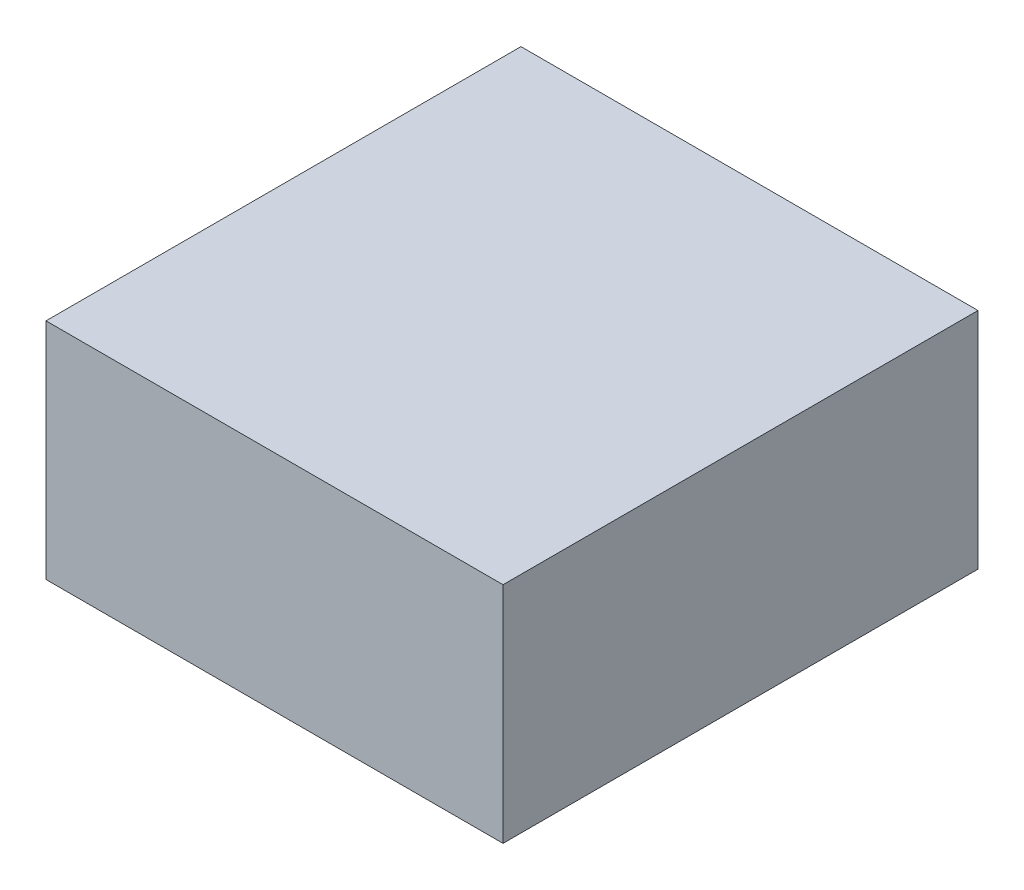
ISO-10303-21;
HEADER;
FILE_DESCRIPTION(('STEP AP214'),'2;1');
FILE_NAME('part.step','',(''),(''),'','','');
FILE_SCHEMA(('AUTOMOTIVE_DESIGN { 1 0 10303 214 1 1 1 1 }'));
ENDSEC;
DATA;
#1=APPLICATION_CONTEXT('core data for automotive mechanical design processes');
#2=APPLICATION_PROTOCOL_DEFINITION('international standard','automotive_design',2000,#1);
#3=PRODUCT_CONTEXT('',#1,'mechanical');
#4=PRODUCT('Part','Part','',(#3));
#5=PRODUCT_RELATED_PRODUCT_CATEGORY('part','',(#4));
#6=PRODUCT_DEFINITION_FORMATION('','',#4);
#7=PRODUCT_DEFINITION_CONTEXT('part definition',#1,'design');
#8=PRODUCT_DEFINITION('design','',#6,#7);
#9=PRODUCT_DEFINITION_SHAPE('','',#8);
#10=(LENGTH_UNIT() NAMED_UNIT(*) SI_UNIT(.MILLI.,.METRE.));
#11=(NAMED_UNIT(*) PLANE_ANGLE_UNIT() SI_UNIT($,.RADIAN.));
#12=(NAMED_UNIT(*) SI_UNIT($,.STERADIAN.) SOLID_ANGLE_UNIT());
#13=UNCERTAINTY_MEASURE_WITH_UNIT(LENGTH_MEASURE(1.E-05),#10,'distance_accuracy_value','');
#14=(GEOMETRIC_REPRESENTATION_CONTEXT(3) GLOBAL_UNCERTAINTY_ASSIGNED_CONTEXT((#13)) GLOBAL_UNIT_ASSIGNED_CONTEXT((#10,
#11,#12)) REPRESENTATION_CONTEXT('',''));
#15=CARTESIAN_POINT('',(0.,0.,0.));
#16=DIRECTION('',(0.,0.,1.));
#17=DIRECTION('',(1.,0.,0.));
#18=AXIS2_PLACEMENT_3D('',#15,#16,#17);
#19=CARTESIAN_POINT('',(-25.5,25.,-26.5));
#20=DIRECTION('',(1.,0.,0.));
#21=DIRECTION('',(0.,0.,-1.));
#22=AXIS2_PLACEMENT_3D('',#19,#20,#21);
#23=PLANE('',#22);
#24=DIRECTION('',(0.,0.,1.));
#25=VECTOR('',#24,1.);
#26=CARTESIAN_POINT('',(-25.5,0.,-26.5));
#27=LINE('',#26,#25);
#28=CARTESIAN_POINT('',(-25.5,0.,-26.5));
#29=VERTEX_POINT('',#28);
#30=CARTESIAN_POINT('',(-25.5,0.,26.5));
#31=VERTEX_POINT('',#30);
#32=EDGE_CURVE('E95',#29,#31,#27,.T.);
#33=ORIENTED_EDGE('',*,*,#32,.T.);
#34=DIRECTION('',(0.,-1.,0.));
#35=VECTOR('',#34,1.);
#36=CARTESIAN_POINT('',(-25.5,25.,26.5));
#37=LINE('',#36,#35);
#38=CARTESIAN_POINT('',(-25.5,25.,26.5));
#39=VERTEX_POINT('',#38);
#40=EDGE_CURVE('E11',#39,#31,#37,.T.);
#41=ORIENTED_EDGE('',*,*,#40,.F.);
#42=DIRECTION('',(0.,0.,1.));
#43=VECTOR('',#42,1.);
#44=CARTESIAN_POINT('',(-25.5,25.,-26.5));
#45=LINE('',#44,#43);
#46=CARTESIAN_POINT('',(-25.5,25.,-26.5));
#47=VERTEX_POINT('',#46);
#48=EDGE_CURVE('E83',#47,#39,#45,.T.);
#49=ORIENTED_EDGE('',*,*,#48,.F.);
#50=DIRECTION('',(0.,-1.,0.));
#51=VECTOR('',#50,1.);
#52=CARTESIAN_POINT('',(-25.5,25.,-26.5));
#53=LINE('',#52,#51);
#54=EDGE_CURVE('E91',#47,#29,#53,.T.);
#55=ORIENTED_EDGE('',*,*,#54,.T.);
#56=EDGE_LOOP('',(#33,#41,#49,#55));
#57=FACE_BOUND('',#56,.T.);
#58=ADVANCED_FACE('F32',(#57),#23,.F.);
#59=CARTESIAN_POINT('',(-25.5,25.,26.5));
#60=DIRECTION('',(0.,0.,-1.));
#61=DIRECTION('',(-1.,0.,0.));
#62=AXIS2_PLACEMENT_3D('',#59,#60,#61);
#63=PLANE('',#62);
#64=DIRECTION('',(1.,0.,0.));
#65=VECTOR('',#64,1.);
#66=CARTESIAN_POINT('',(-25.5,0.,26.5));
#67=LINE('',#66,#65);
#68=CARTESIAN_POINT('',(25.5,0.,26.5));
#69=VERTEX_POINT('',#68);
#70=EDGE_CURVE('E87',#31,#69,#67,.T.);
#71=ORIENTED_EDGE('',*,*,#70,.T.);
#72=DIRECTION('',(0.,-1.,0.));
#73=VECTOR('',#72,1.);
#74=CARTESIAN_POINT('',(25.5,25.,26.5));
#75=LINE('',#74,#73);
#76=CARTESIAN_POINT('',(25.5,25.,26.5));
#77=VERTEX_POINT('',#76);
#78=EDGE_CURVE('E40',#77,#69,#75,.T.);
#79=ORIENTED_EDGE('',*,*,#78,.F.);
#80=DIRECTION('',(1.,0.,0.));
#81=VECTOR('',#80,1.);
#82=CARTESIAN_POINT('',(-25.5,25.,26.5));
#83=LINE('',#82,#81);
#84=EDGE_CURVE('E78',#39,#77,#83,.T.);
#85=ORIENTED_EDGE('',*,*,#84,.F.);
#86=ORIENTED_EDGE('',*,*,#40,.T.);
#87=EDGE_LOOP('',(#71,#79,#85,#86));
#88=FACE_BOUND('',#87,.T.);
#89=ADVANCED_FACE('F86',(#88),#63,.F.);
#90=CARTESIAN_POINT('',(25.5,25.,-26.5));
#91=DIRECTION('',(-1.,0.,0.));
#92=DIRECTION('',(0.,0.,1.));
#93=AXIS2_PLACEMENT_3D('',#90,#91,#92);
#94=PLANE('',#93);
#95=DIRECTION('',(0.,0.,-1.));
#96=VECTOR('',#95,1.);
#97=CARTESIAN_POINT('',(25.5,0.,-26.5));
#98=LINE('',#97,#96);
#99=CARTESIAN_POINT('',(25.5,0.,-26.5));
#100=VERTEX_POINT('',#99);
#101=EDGE_CURVE('E65',#69,#100,#98,.T.);
#102=ORIENTED_EDGE('',*,*,#101,.T.);
#103=DIRECTION('',(0.,-1.,0.));
#104=VECTOR('',#103,1.);
#105=CARTESIAN_POINT('',(25.5,25.,-26.5));
#106=LINE('',#105,#104);
#107=CARTESIAN_POINT('',(25.5,25.,-26.5));
#108=VERTEX_POINT('',#107);
#109=EDGE_CURVE('E88',#108,#100,#106,.T.);
#110=ORIENTED_EDGE('',*,*,#109,.F.);
#111=DIRECTION('',(0.,0.,-1.));
#112=VECTOR('',#111,1.);
#113=CARTESIAN_POINT('',(25.5,25.,-26.5));
#114=LINE('',#113,#112);
#115=EDGE_CURVE('E81',#77,#108,#114,.T.);
#116=ORIENTED_EDGE('',*,*,#115,.F.);
#117=ORIENTED_EDGE('',*,*,#78,.T.);
#118=EDGE_LOOP('',(#102,#110,#116,#117));
#119=FACE_BOUND('',#118,.T.);
#120=ADVANCED_FACE('F89',(#119),#94,.F.);
#121=CARTESIAN_POINT('',(-25.5,25.,-26.5));
#122=DIRECTION('',(0.,0.,1.));
#123=DIRECTION('',(1.,0.,0.));
#124=AXIS2_PLACEMENT_3D('',#121,#122,#123);
#125=PLANE('',#124);
#126=DIRECTION('',(-1.,0.,0.));
#127=VECTOR('',#126,1.);
#128=CARTESIAN_POINT('',(-25.5,0.,-26.5));
#129=LINE('',#128,#127);
#130=EDGE_CURVE('E71',#100,#29,#129,.T.);
#131=ORIENTED_EDGE('',*,*,#130,.T.);
#132=ORIENTED_EDGE('',*,*,#54,.F.);
#133=DIRECTION('',(-1.,0.,0.));
#134=VECTOR('',#133,1.);
#135=CARTESIAN_POINT('',(-25.5,25.,-26.5));
#136=LINE('',#135,#134);
#137=EDGE_CURVE('E48',#108,#47,#136,.T.);
#138=ORIENTED_EDGE('',*,*,#137,.F.);
#139=ORIENTED_EDGE('',*,*,#109,.T.);
#140=EDGE_LOOP('',(#131,#132,#138,#139));
#141=FACE_BOUND('',#140,.T.);
#142=ADVANCED_FACE('F102',(#141),#125,.F.);
#143=CARTESIAN_POINT('',(0.,25.,0.));
#144=DIRECTION('',(0.,1.,0.));
#145=DIRECTION('',(0.,0.,1.));
#146=AXIS2_PLACEMENT_3D('',#143,#144,#145);
#147=PLANE('',#146);
#148=ORIENTED_EDGE('',*,*,#48,.T.);
#149=ORIENTED_EDGE('',*,*,#84,.T.);
#150=ORIENTED_EDGE('',*,*,#115,.T.);
#151=ORIENTED_EDGE('',*,*,#137,.T.);
#152=EDGE_LOOP('',(#148,#149,#150,#151));
#153=FACE_BOUND('',#152,.T.);
#154=ADVANCED_FACE('F79',(#153),#147,.T.);
#155=CARTESIAN_POINT('',(0.,0.,0.));
#156=DIRECTION('',(0.,1.,0.));
#157=DIRECTION('',(0.,0.,1.));
#158=AXIS2_PLACEMENT_3D('',#155,#156,#157);
#159=PLANE('',#158);
#160=ORIENTED_EDGE('',*,*,#32,.F.);
#161=ORIENTED_EDGE('',*,*,#130,.F.);
#162=ORIENTED_EDGE('',*,*,#101,.F.);
#163=ORIENTED_EDGE('',*,*,#70,.F.);
#164=EDGE_LOOP('',(#160,#161,#162,#163));
#165=FACE_BOUND('',#164,.T.);
#166=ADVANCED_FACE('F105',(#165),#159,.F.);
#167=CLOSED_SHELL('',(#58,#89,#120,#142,#154,#166));
#168=MANIFOLD_SOLID_BREP('B2',#167);
#169=ADVANCED_BREP_SHAPE_REPRESENTATION('',(#18,#168),#14);
#170=SHAPE_DEFINITION_REPRESENTATION(#9,#169);
ENDSEC;
END-ISO-10303-21;
